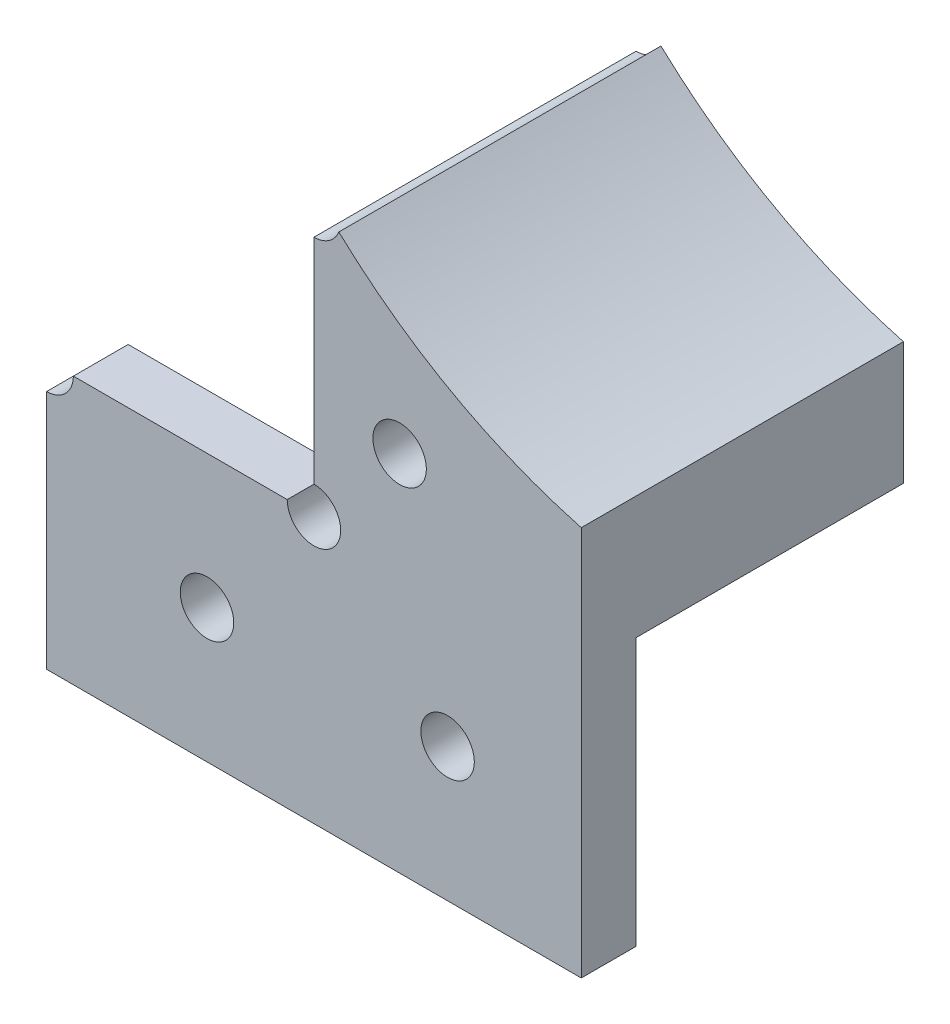
ISO-10303-21;
HEADER;
FILE_DESCRIPTION(('STEP AP214'),'2;1');
FILE_NAME('part.step','',(''),(''),'','','');
FILE_SCHEMA(('AUTOMOTIVE_DESIGN { 1 0 10303 214 1 1 1 1 }'));
ENDSEC;
DATA;
#1=APPLICATION_CONTEXT('core data for automotive mechanical design processes');
#2=APPLICATION_PROTOCOL_DEFINITION('international standard','automotive_design',2000,#1);
#3=PRODUCT_CONTEXT('',#1,'mechanical');
#4=PRODUCT('Part','Part','',(#3));
#5=PRODUCT_RELATED_PRODUCT_CATEGORY('part','',(#4));
#6=PRODUCT_DEFINITION_FORMATION('','',#4);
#7=PRODUCT_DEFINITION_CONTEXT('part definition',#1,'design');
#8=PRODUCT_DEFINITION('design','',#6,#7);
#9=PRODUCT_DEFINITION_SHAPE('','',#8);
#10=(LENGTH_UNIT() NAMED_UNIT(*) SI_UNIT(.MILLI.,.METRE.));
#11=(NAMED_UNIT(*) PLANE_ANGLE_UNIT() SI_UNIT($,.RADIAN.));
#12=(NAMED_UNIT(*) SI_UNIT($,.STERADIAN.) SOLID_ANGLE_UNIT());
#13=UNCERTAINTY_MEASURE_WITH_UNIT(LENGTH_MEASURE(1.E-05),#10,'distance_accuracy_value','');
#14=(GEOMETRIC_REPRESENTATION_CONTEXT(3) GLOBAL_UNCERTAINTY_ASSIGNED_CONTEXT((#13)) GLOBAL_UNIT_ASSIGNED_CONTEXT((#10,
#11,#12)) REPRESENTATION_CONTEXT('',''));
#15=CARTESIAN_POINT('',(0.,0.,0.));
#16=DIRECTION('',(0.,0.,1.));
#17=DIRECTION('',(1.,0.,0.));
#18=AXIS2_PLACEMENT_3D('',#15,#16,#17);
#19=CARTESIAN_POINT('',(10.,10.,4.1));
#20=DIRECTION('',(0.,-1.,0.));
#21=DIRECTION('',(1.,0.,0.));
#22=AXIS2_PLACEMENT_3D('',#19,#20,#21);
#23=PLANE('',#22);
#24=DIRECTION('',(-1.,0.,0.));
#25=VECTOR('',#24,1.);
#26=CARTESIAN_POINT('',(10.,10.,0.));
#27=LINE('',#26,#25);
#28=CARTESIAN_POINT('',(-12.,10.,0.));
#29=VERTEX_POINT('',#28);
#30=CARTESIAN_POINT('',(-28.,10.,0.));
#31=VERTEX_POINT('',#30);
#32=EDGE_CURVE('E182',#29,#31,#27,.T.);
#33=ORIENTED_EDGE('',*,*,#32,.T.);
#34=DIRECTION('',(0.,0.,1.));
#35=VECTOR('',#34,1.);
#36=CARTESIAN_POINT('',(-28.,10.,-20.));
#37=LINE('',#36,#35);
#38=CARTESIAN_POINT('',(-28.,10.,4.1));
#39=VERTEX_POINT('',#38);
#40=EDGE_CURVE('E154',#31,#39,#37,.T.);
#41=ORIENTED_EDGE('',*,*,#40,.T.);
#42=DIRECTION('',(-1.,0.,0.));
#43=VECTOR('',#42,1.);
#44=CARTESIAN_POINT('',(10.,10.,4.1));
#45=LINE('',#44,#43);
#46=CARTESIAN_POINT('',(-12.,10.,4.1));
#47=VERTEX_POINT('',#46);
#48=EDGE_CURVE('E172',#47,#39,#45,.T.);
#49=ORIENTED_EDGE('',*,*,#48,.F.);
#50=DIRECTION('',(0.,0.,1.));
#51=VECTOR('',#50,1.);
#52=CARTESIAN_POINT('',(-12.,10.,-20.));
#53=LINE('',#52,#51);
#54=EDGE_CURVE('E126',#29,#47,#53,.T.);
#55=ORIENTED_EDGE('',*,*,#54,.F.);
#56=EDGE_LOOP('',(#33,#41,#49,#55));
#57=FACE_BOUND('',#56,.T.);
#58=ADVANCED_FACE('F38',(#57),#23,.F.);
#59=CARTESIAN_POINT('',(0.,0.,4.1));
#60=DIRECTION('',(0.,0.,1.));
#61=DIRECTION('',(1.,0.,0.));
#62=AXIS2_PLACEMENT_3D('',#59,#60,#61);
#63=PLANE('',#62);
#64=CARTESIAN_POINT('',(-30.,10.,4.1));
#65=DIRECTION('',(0.,0.,1.));
#66=DIRECTION('',(1.,0.,0.));
#67=AXIS2_PLACEMENT_3D('',#64,#65,#66);
#68=CIRCLE('',#67,2.);
#69=CARTESIAN_POINT('',(-30.,8.,4.1));
#70=VERTEX_POINT('',#69);
#71=EDGE_CURVE('E221',#70,#39,#68,.T.);
#72=ORIENTED_EDGE('',*,*,#71,.F.);
#73=DIRECTION('',(0.,-1.,0.));
#74=VECTOR('',#73,1.);
#75=CARTESIAN_POINT('',(-30.,-10.,4.1));
#76=LINE('',#75,#74);
#77=CARTESIAN_POINT('',(-30.,-10.,4.1));
#78=VERTEX_POINT('',#77);
#79=EDGE_CURVE('E175',#70,#78,#76,.T.);
#80=ORIENTED_EDGE('',*,*,#79,.T.);
#81=DIRECTION('',(1.,0.,0.));
#82=VECTOR('',#81,1.);
#83=CARTESIAN_POINT('',(10.,-10.,4.1));
#84=LINE('',#83,#82);
#85=CARTESIAN_POINT('',(10.,-10.,4.1));
#86=VERTEX_POINT('',#85);
#87=EDGE_CURVE('E177',#78,#86,#84,.T.);
#88=ORIENTED_EDGE('',*,*,#87,.T.);
#89=DIRECTION('',(0.,1.,0.));
#90=VECTOR('',#89,1.);
#91=CARTESIAN_POINT('',(10.,-10.,4.1));
#92=LINE('',#91,#90);
#93=CARTESIAN_POINT('',(10.,19.1783710073717,4.1));
#94=VERTEX_POINT('',#93);
#95=EDGE_CURVE('E169',#86,#94,#92,.T.);
#96=ORIENTED_EDGE('',*,*,#95,.T.);
#97=CARTESIAN_POINT('',(21.2157347929413,60.6899030563627,4.1));
#98=DIRECTION('',(0.,0.,1.));
#99=DIRECTION('',(1.,0.,0.));
#100=AXIS2_PLACEMENT_3D('',#97,#98,#99);
#101=CIRCLE('',#100,43.);
#102=CARTESIAN_POINT('',(-8.1386652305326,29.2682672099928,4.1));
#103=VERTEX_POINT('',#102);
#104=EDGE_CURVE('E235',#103,#94,#101,.T.);
#105=ORIENTED_EDGE('',*,*,#104,.F.);
#106=CARTESIAN_POINT('',(-10.,30.,4.1));
#107=DIRECTION('',(0.,0.,1.));
#108=DIRECTION('',(1.,0.,0.));
#109=AXIS2_PLACEMENT_3D('',#106,#107,#108);
#110=CIRCLE('',#109,2.);
#111=CARTESIAN_POINT('',(-10.,28.,4.1));
#112=VERTEX_POINT('',#111);
#113=EDGE_CURVE('E148',#112,#103,#110,.T.);
#114=ORIENTED_EDGE('',*,*,#113,.F.);
#115=DIRECTION('',(0.,-1.,0.));
#116=VECTOR('',#115,1.);
#117=CARTESIAN_POINT('',(-10.,10.,4.1));
#118=LINE('',#117,#116);
#119=CARTESIAN_POINT('',(-10.,12.,4.1));
#120=VERTEX_POINT('',#119);
#121=EDGE_CURVE('E138',#112,#120,#118,.T.);
#122=ORIENTED_EDGE('',*,*,#121,.T.);
#123=CARTESIAN_POINT('',(-10.,10.,4.1));
#124=DIRECTION('',(0.,0.,1.));
#125=DIRECTION('',(1.,0.,0.));
#126=AXIS2_PLACEMENT_3D('',#123,#124,#125);
#127=CIRCLE('',#126,2.);
#128=EDGE_CURVE('E120',#47,#120,#127,.T.);
#129=ORIENTED_EDGE('',*,*,#128,.F.);
#130=ORIENTED_EDGE('',*,*,#48,.T.);
#131=EDGE_LOOP('',(#72,#80,#88,#96,#105,#114,#122,#129,#130));
#132=FACE_BOUND('',#131,.T.);
#133=CARTESIAN_POINT('',(-18.,0.,4.1));
#134=DIRECTION('',(0.,0.,1.));
#135=DIRECTION('',(1.,0.,0.));
#136=AXIS2_PLACEMENT_3D('',#133,#134,#135);
#137=CIRCLE('',#136,2.);
#138=CARTESIAN_POINT('',(-16.,0.,4.1));
#139=VERTEX_POINT('',#138);
#140=EDGE_CURVE('E224',#139,#139,#137,.T.);
#141=ORIENTED_EDGE('',*,*,#140,.F.);
#142=EDGE_LOOP('',(#141));
#143=FACE_BOUND('',#142,.T.);
#144=CARTESIAN_POINT('',(-3.58918550368584,17.1783710073717,4.1));
#145=DIRECTION('',(0.,0.,1.));
#146=DIRECTION('',(1.,0.,0.));
#147=AXIS2_PLACEMENT_3D('',#144,#145,#146);
#148=CIRCLE('',#147,2.);
#149=CARTESIAN_POINT('',(-1.58918550368584,17.1783710073717,4.1));
#150=VERTEX_POINT('',#149);
#151=EDGE_CURVE('E284',#150,#150,#148,.T.);
#152=ORIENTED_EDGE('',*,*,#151,.F.);
#153=EDGE_LOOP('',(#152));
#154=FACE_BOUND('',#153,.T.);
#155=CARTESIAN_POINT('',(0.,0.,4.1));
#156=DIRECTION('',(0.,0.,1.));
#157=DIRECTION('',(1.,0.,0.));
#158=AXIS2_PLACEMENT_3D('',#155,#156,#157);
#159=CIRCLE('',#158,2.);
#160=CARTESIAN_POINT('',(2.,0.,4.1));
#161=VERTEX_POINT('',#160);
#162=EDGE_CURVE('E163',#161,#161,#159,.T.);
#163=ORIENTED_EDGE('',*,*,#162,.F.);
#164=EDGE_LOOP('',(#163));
#165=FACE_BOUND('',#164,.T.);
#166=ADVANCED_FACE('F144',(#132,#143,#154,#165),#63,.T.);
#167=CARTESIAN_POINT('',(0.,0.,0.));
#168=DIRECTION('',(0.,0.,1.));
#169=DIRECTION('',(1.,0.,0.));
#170=AXIS2_PLACEMENT_3D('',#167,#168,#169);
#171=PLANE('',#170);
#172=CARTESIAN_POINT('',(-18.,0.,0.));
#173=DIRECTION('',(0.,0.,1.));
#174=DIRECTION('',(1.,0.,0.));
#175=AXIS2_PLACEMENT_3D('',#172,#173,#174);
#176=CIRCLE('',#175,2.);
#177=CARTESIAN_POINT('',(-16.,0.,0.));
#178=VERTEX_POINT('',#177);
#179=EDGE_CURVE('E42',#178,#178,#176,.T.);
#180=ORIENTED_EDGE('',*,*,#179,.T.);
#181=EDGE_LOOP('',(#180));
#182=FACE_BOUND('',#181,.T.);
#183=DIRECTION('',(0.,-1.,0.));
#184=VECTOR('',#183,1.);
#185=CARTESIAN_POINT('',(-30.,-10.,0.));
#186=LINE('',#185,#184);
#187=CARTESIAN_POINT('',(-30.,8.,0.));
#188=VERTEX_POINT('',#187);
#189=CARTESIAN_POINT('',(-30.,-10.,0.));
#190=VERTEX_POINT('',#189);
#191=EDGE_CURVE('E186',#188,#190,#186,.T.);
#192=ORIENTED_EDGE('',*,*,#191,.F.);
#193=CARTESIAN_POINT('',(-30.,10.,0.));
#194=DIRECTION('',(0.,0.,1.));
#195=DIRECTION('',(1.,0.,0.));
#196=AXIS2_PLACEMENT_3D('',#193,#194,#195);
#197=CIRCLE('',#196,2.);
#198=EDGE_CURVE('E54',#188,#31,#197,.T.);
#199=ORIENTED_EDGE('',*,*,#198,.T.);
#200=ORIENTED_EDGE('',*,*,#32,.F.);
#201=CARTESIAN_POINT('',(-10.,10.,0.));
#202=DIRECTION('',(0.,0.,1.));
#203=DIRECTION('',(1.,0.,0.));
#204=AXIS2_PLACEMENT_3D('',#201,#202,#203);
#205=CIRCLE('',#204,2.);
#206=CARTESIAN_POINT('',(-8.,10.,0.));
#207=VERTEX_POINT('',#206);
#208=EDGE_CURVE('E205',#29,#207,#205,.T.);
#209=ORIENTED_EDGE('',*,*,#208,.T.);
#210=CARTESIAN_POINT('',(10.,10.,0.));
#211=VERTEX_POINT('',#210);
#212=EDGE_CURVE('E183',#211,#207,#27,.T.);
#213=ORIENTED_EDGE('',*,*,#212,.F.);
#214=DIRECTION('',(0.,1.,0.));
#215=VECTOR('',#214,1.);
#216=CARTESIAN_POINT('',(10.,-10.,0.));
#217=LINE('',#216,#215);
#218=CARTESIAN_POINT('',(10.,-10.,0.));
#219=VERTEX_POINT('',#218);
#220=EDGE_CURVE('E166',#219,#211,#217,.T.);
#221=ORIENTED_EDGE('',*,*,#220,.F.);
#222=DIRECTION('',(1.,0.,0.));
#223=VECTOR('',#222,1.);
#224=CARTESIAN_POINT('',(10.,-10.,0.));
#225=LINE('',#224,#223);
#226=EDGE_CURVE('E173',#190,#219,#225,.T.);
#227=ORIENTED_EDGE('',*,*,#226,.F.);
#228=EDGE_LOOP('',(#192,#199,#200,#209,#213,#221,#227));
#229=FACE_BOUND('',#228,.T.);
#230=CARTESIAN_POINT('',(0.,0.,0.));
#231=DIRECTION('',(0.,0.,1.));
#232=DIRECTION('',(1.,0.,0.));
#233=AXIS2_PLACEMENT_3D('',#230,#231,#232);
#234=CIRCLE('',#233,2.);
#235=CARTESIAN_POINT('',(2.,0.,0.));
#236=VERTEX_POINT('',#235);
#237=EDGE_CURVE('E162',#236,#236,#234,.T.);
#238=ORIENTED_EDGE('',*,*,#237,.T.);
#239=EDGE_LOOP('',(#238));
#240=FACE_BOUND('',#239,.T.);
#241=ADVANCED_FACE('F260',(#182,#229,#240),#171,.F.);
#242=CARTESIAN_POINT('',(10.,-10.,4.1));
#243=DIRECTION('',(-1.,0.,0.));
#244=DIRECTION('',(0.,0.,1.));
#245=AXIS2_PLACEMENT_3D('',#242,#243,#244);
#246=PLANE('',#245);
#247=DIRECTION('',(0.,1.,0.));
#248=VECTOR('',#247,1.);
#249=CARTESIAN_POINT('',(10.,10.,-20.));
#250=LINE('',#249,#248);
#251=CARTESIAN_POINT('',(10.,10.,-20.));
#252=VERTEX_POINT('',#251);
#253=CARTESIAN_POINT('',(10.,19.1783710073717,-20.));
#254=VERTEX_POINT('',#253);
#255=EDGE_CURVE('E149',#252,#254,#250,.T.);
#256=ORIENTED_EDGE('',*,*,#255,.T.);
#257=DIRECTION('',(0.,0.,1.));
#258=VECTOR('',#257,1.);
#259=CARTESIAN_POINT('',(10.,19.1783710073717,-20.));
#260=LINE('',#259,#258);
#261=EDGE_CURVE('E206',#254,#94,#260,.T.);
#262=ORIENTED_EDGE('',*,*,#261,.T.);
#263=ORIENTED_EDGE('',*,*,#95,.F.);
#264=DIRECTION('',(0.,0.,-1.));
#265=VECTOR('',#264,1.);
#266=CARTESIAN_POINT('',(10.,-10.,4.1));
#267=LINE('',#266,#265);
#268=EDGE_CURVE('E179',#86,#219,#267,.T.);
#269=ORIENTED_EDGE('',*,*,#268,.T.);
#270=ORIENTED_EDGE('',*,*,#220,.T.);
#271=DIRECTION('',(0.,0.,1.));
#272=VECTOR('',#271,1.);
#273=CARTESIAN_POINT('',(10.,10.,-20.));
#274=LINE('',#273,#272);
#275=EDGE_CURVE('E159',#252,#211,#274,.T.);
#276=ORIENTED_EDGE('',*,*,#275,.F.);
#277=EDGE_LOOP('',(#256,#262,#263,#269,#270,#276));
#278=FACE_BOUND('',#277,.T.);
#279=ADVANCED_FACE('F40',(#278),#246,.F.);
#280=CARTESIAN_POINT('',(-30.,-10.,4.1));
#281=DIRECTION('',(1.,0.,0.));
#282=DIRECTION('',(0.,0.,-1.));
#283=AXIS2_PLACEMENT_3D('',#280,#281,#282);
#284=PLANE('',#283);
#285=ORIENTED_EDGE('',*,*,#79,.F.);
#286=DIRECTION('',(0.,0.,1.));
#287=VECTOR('',#286,1.);
#288=CARTESIAN_POINT('',(-30.,8.,-20.));
#289=LINE('',#288,#287);
#290=EDGE_CURVE('E11',#70,#188,#289,.F.);
#291=ORIENTED_EDGE('',*,*,#290,.T.);
#292=ORIENTED_EDGE('',*,*,#191,.T.);
#293=DIRECTION('',(0.,0.,-1.));
#294=VECTOR('',#293,1.);
#295=CARTESIAN_POINT('',(-30.,-10.,4.1));
#296=LINE('',#295,#294);
#297=EDGE_CURVE('E191',#78,#190,#296,.T.);
#298=ORIENTED_EDGE('',*,*,#297,.F.);
#299=EDGE_LOOP('',(#285,#291,#292,#298));
#300=FACE_BOUND('',#299,.T.);
#301=ADVANCED_FACE('F227',(#300),#284,.F.);
#302=CARTESIAN_POINT('',(10.,-10.,4.1));
#303=DIRECTION('',(0.,1.,0.));
#304=DIRECTION('',(-1.,0.,0.));
#305=AXIS2_PLACEMENT_3D('',#302,#303,#304);
#306=PLANE('',#305);
#307=ORIENTED_EDGE('',*,*,#226,.T.);
#308=ORIENTED_EDGE('',*,*,#268,.F.);
#309=ORIENTED_EDGE('',*,*,#87,.F.);
#310=ORIENTED_EDGE('',*,*,#297,.T.);
#311=EDGE_LOOP('',(#307,#308,#309,#310));
#312=FACE_BOUND('',#311,.T.);
#313=ADVANCED_FACE('F233',(#312),#306,.F.);
#314=CARTESIAN_POINT('',(0.,0.,4.1));
#315=DIRECTION('',(0.,0.,-1.));
#316=DIRECTION('',(-1.,0.,0.));
#317=AXIS2_PLACEMENT_3D('',#314,#315,#316);
#318=CYLINDRICAL_SURFACE('',#317,2.);
#319=ORIENTED_EDGE('',*,*,#162,.T.);
#320=EDGE_LOOP('',(#319));
#321=FACE_BOUND('',#320,.T.);
#322=ORIENTED_EDGE('',*,*,#237,.F.);
#323=EDGE_LOOP('',(#322));
#324=FACE_BOUND('',#323,.T.);
#325=ADVANCED_FACE('F267',(#321,#324),#318,.F.);
#326=CARTESIAN_POINT('',(10.,10.,-20.));
#327=DIRECTION('',(0.,-1.,0.));
#328=DIRECTION('',(1.,0.,0.));
#329=AXIS2_PLACEMENT_3D('',#326,#327,#328);
#330=PLANE('',#329);
#331=DIRECTION('',(0.,0.,1.));
#332=VECTOR('',#331,1.);
#333=CARTESIAN_POINT('',(-8.,10.,-20.));
#334=LINE('',#333,#332);
#335=CARTESIAN_POINT('',(-8.,10.,-20.));
#336=VERTEX_POINT('',#335);
#337=EDGE_CURVE('E200',#336,#207,#334,.T.);
#338=ORIENTED_EDGE('',*,*,#337,.F.);
#339=DIRECTION('',(1.,0.,0.));
#340=VECTOR('',#339,1.);
#341=CARTESIAN_POINT('',(10.,10.,-20.));
#342=LINE('',#341,#340);
#343=EDGE_CURVE('E157',#336,#252,#342,.T.);
#344=ORIENTED_EDGE('',*,*,#343,.T.);
#345=ORIENTED_EDGE('',*,*,#275,.T.);
#346=ORIENTED_EDGE('',*,*,#212,.T.);
#347=EDGE_LOOP('',(#338,#344,#345,#346));
#348=FACE_BOUND('',#347,.T.);
#349=ADVANCED_FACE('F203',(#348),#330,.T.);
#350=CARTESIAN_POINT('',(-10.,10.,-20.));
#351=DIRECTION('',(-1.,0.,0.));
#352=DIRECTION('',(0.,0.,1.));
#353=AXIS2_PLACEMENT_3D('',#350,#351,#352);
#354=PLANE('',#353);
#355=DIRECTION('',(0.,0.,1.));
#356=VECTOR('',#355,1.);
#357=CARTESIAN_POINT('',(-10.,12.,-20.));
#358=LINE('',#357,#356);
#359=CARTESIAN_POINT('',(-10.,12.,-20.));
#360=VERTEX_POINT('',#359);
#361=EDGE_CURVE('E123',#360,#120,#358,.T.);
#362=ORIENTED_EDGE('',*,*,#361,.T.);
#363=ORIENTED_EDGE('',*,*,#121,.F.);
#364=DIRECTION('',(0.,0.,1.));
#365=VECTOR('',#364,1.);
#366=CARTESIAN_POINT('',(-10.,28.,-20.));
#367=LINE('',#366,#365);
#368=CARTESIAN_POINT('',(-10.,28.,-20.));
#369=VERTEX_POINT('',#368);
#370=EDGE_CURVE('E213',#369,#112,#367,.T.);
#371=ORIENTED_EDGE('',*,*,#370,.F.);
#372=DIRECTION('',(0.,-1.,0.));
#373=VECTOR('',#372,1.);
#374=CARTESIAN_POINT('',(-10.,10.,-20.));
#375=LINE('',#374,#373);
#376=EDGE_CURVE('E140',#369,#360,#375,.T.);
#377=ORIENTED_EDGE('',*,*,#376,.T.);
#378=EDGE_LOOP('',(#362,#363,#371,#377));
#379=FACE_BOUND('',#378,.T.);
#380=ADVANCED_FACE('F136',(#379),#354,.T.);
#381=CARTESIAN_POINT('',(0.,0.,-20.));
#382=DIRECTION('',(0.,0.,1.));
#383=DIRECTION('',(1.,0.,0.));
#384=AXIS2_PLACEMENT_3D('',#381,#382,#383);
#385=PLANE('',#384);
#386=CARTESIAN_POINT('',(-3.58918550368584,17.1783710073717,-20.));
#387=DIRECTION('',(0.,0.,1.));
#388=DIRECTION('',(1.,0.,0.));
#389=AXIS2_PLACEMENT_3D('',#386,#387,#388);
#390=CIRCLE('',#389,2.);
#391=CARTESIAN_POINT('',(-1.58918550368584,17.1783710073717,-20.));
#392=VERTEX_POINT('',#391);
#393=EDGE_CURVE('E131',#392,#392,#390,.T.);
#394=ORIENTED_EDGE('',*,*,#393,.T.);
#395=EDGE_LOOP('',(#394));
#396=FACE_BOUND('',#395,.T.);
#397=ORIENTED_EDGE('',*,*,#343,.F.);
#398=CARTESIAN_POINT('',(-10.,10.,-20.));
#399=DIRECTION('',(0.,0.,1.));
#400=DIRECTION('',(1.,0.,0.));
#401=AXIS2_PLACEMENT_3D('',#398,#399,#400);
#402=CIRCLE('',#401,2.);
#403=EDGE_CURVE('E47',#336,#360,#402,.T.);
#404=ORIENTED_EDGE('',*,*,#403,.T.);
#405=ORIENTED_EDGE('',*,*,#376,.F.);
#406=CARTESIAN_POINT('',(-10.,30.,-20.));
#407=DIRECTION('',(0.,0.,1.));
#408=DIRECTION('',(1.,0.,0.));
#409=AXIS2_PLACEMENT_3D('',#406,#407,#408);
#410=CIRCLE('',#409,2.);
#411=CARTESIAN_POINT('',(-8.1386652305326,29.2682672099928,-20.));
#412=VERTEX_POINT('',#411);
#413=EDGE_CURVE('E239',#369,#412,#410,.T.);
#414=ORIENTED_EDGE('',*,*,#413,.T.);
#415=CARTESIAN_POINT('',(21.2157347929413,60.6899030563627,-20.));
#416=DIRECTION('',(0.,0.,1.));
#417=DIRECTION('',(1.,0.,0.));
#418=AXIS2_PLACEMENT_3D('',#415,#416,#417);
#419=CIRCLE('',#418,43.);
#420=EDGE_CURVE('E61',#412,#254,#419,.T.);
#421=ORIENTED_EDGE('',*,*,#420,.T.);
#422=ORIENTED_EDGE('',*,*,#255,.F.);
#423=EDGE_LOOP('',(#397,#404,#405,#414,#421,#422));
#424=FACE_BOUND('',#423,.T.);
#425=ADVANCED_FACE('F196',(#396,#424),#385,.F.);
#426=CARTESIAN_POINT('',(21.2157347929413,60.6899030563627,-20.));
#427=DIRECTION('',(0.,0.,1.));
#428=DIRECTION('',(1.,0.,0.));
#429=AXIS2_PLACEMENT_3D('',#426,#427,#428);
#430=CYLINDRICAL_SURFACE('',#429,43.);
#431=ORIENTED_EDGE('',*,*,#104,.T.);
#432=ORIENTED_EDGE('',*,*,#261,.F.);
#433=ORIENTED_EDGE('',*,*,#420,.F.);
#434=DIRECTION('',(0.,0.,1.));
#435=VECTOR('',#434,1.);
#436=CARTESIAN_POINT('',(-8.1386652305326,29.2682672099928,-20.));
#437=LINE('',#436,#435);
#438=EDGE_CURVE('E210',#412,#103,#437,.T.);
#439=ORIENTED_EDGE('',*,*,#438,.T.);
#440=EDGE_LOOP('',(#431,#432,#433,#439));
#441=FACE_BOUND('',#440,.T.);
#442=ADVANCED_FACE('F238',(#441),#430,.F.);
#443=CARTESIAN_POINT('',(-10.,30.,-20.));
#444=DIRECTION('',(0.,0.,1.));
#445=DIRECTION('',(1.,0.,0.));
#446=AXIS2_PLACEMENT_3D('',#443,#444,#445);
#447=CYLINDRICAL_SURFACE('',#446,2.);
#448=ORIENTED_EDGE('',*,*,#113,.T.);
#449=ORIENTED_EDGE('',*,*,#438,.F.);
#450=ORIENTED_EDGE('',*,*,#413,.F.);
#451=ORIENTED_EDGE('',*,*,#370,.T.);
#452=EDGE_LOOP('',(#448,#449,#450,#451));
#453=FACE_BOUND('',#452,.T.);
#454=ADVANCED_FACE('F245',(#453),#447,.F.);
#455=CARTESIAN_POINT('',(-10.,10.,-20.));
#456=DIRECTION('',(0.,0.,1.));
#457=DIRECTION('',(1.,0.,0.));
#458=AXIS2_PLACEMENT_3D('',#455,#456,#457);
#459=CYLINDRICAL_SURFACE('',#458,2.);
#460=ORIENTED_EDGE('',*,*,#54,.T.);
#461=ORIENTED_EDGE('',*,*,#128,.T.);
#462=ORIENTED_EDGE('',*,*,#361,.F.);
#463=ORIENTED_EDGE('',*,*,#403,.F.);
#464=ORIENTED_EDGE('',*,*,#337,.T.);
#465=ORIENTED_EDGE('',*,*,#208,.F.);
#466=EDGE_LOOP('',(#460,#461,#462,#463,#464,#465));
#467=FACE_BOUND('',#466,.T.);
#468=ADVANCED_FACE('F122',(#467),#459,.F.);
#469=CARTESIAN_POINT('',(-3.58918550368584,17.1783710073717,-20.));
#470=DIRECTION('',(0.,0.,1.));
#471=DIRECTION('',(1.,0.,0.));
#472=AXIS2_PLACEMENT_3D('',#469,#470,#471);
#473=CYLINDRICAL_SURFACE('',#472,2.);
#474=ORIENTED_EDGE('',*,*,#393,.F.);
#475=EDGE_LOOP('',(#474));
#476=FACE_BOUND('',#475,.T.);
#477=ORIENTED_EDGE('',*,*,#151,.T.);
#478=EDGE_LOOP('',(#477));
#479=FACE_BOUND('',#478,.T.);
#480=ADVANCED_FACE('F252',(#476,#479),#473,.F.);
#481=CARTESIAN_POINT('',(-30.,10.,-20.));
#482=DIRECTION('',(0.,0.,1.));
#483=DIRECTION('',(1.,0.,0.));
#484=AXIS2_PLACEMENT_3D('',#481,#482,#483);
#485=CYLINDRICAL_SURFACE('',#484,2.);
#486=ORIENTED_EDGE('',*,*,#198,.F.);
#487=ORIENTED_EDGE('',*,*,#290,.F.);
#488=ORIENTED_EDGE('',*,*,#71,.T.);
#489=ORIENTED_EDGE('',*,*,#40,.F.);
#490=EDGE_LOOP('',(#486,#487,#488,#489));
#491=FACE_BOUND('',#490,.T.);
#492=ADVANCED_FACE('F304',(#491),#485,.F.);
#493=CARTESIAN_POINT('',(-18.,0.,-20.));
#494=DIRECTION('',(0.,0.,1.));
#495=DIRECTION('',(1.,0.,0.));
#496=AXIS2_PLACEMENT_3D('',#493,#494,#495);
#497=CYLINDRICAL_SURFACE('',#496,2.);
#498=ORIENTED_EDGE('',*,*,#140,.T.);
#499=EDGE_LOOP('',(#498));
#500=FACE_BOUND('',#499,.T.);
#501=ORIENTED_EDGE('',*,*,#179,.F.);
#502=EDGE_LOOP('',(#501));
#503=FACE_BOUND('',#502,.T.);
#504=ADVANCED_FACE('F293',(#500,#503),#497,.F.);
#505=CLOSED_SHELL('',(#58,#166,#241,#279,#301,#313,#325,#349,#380,#425,#442,#454,#468,#480,#492,#504));
#506=MANIFOLD_SOLID_BREP('B2',#505);
#507=ADVANCED_BREP_SHAPE_REPRESENTATION('',(#18,#506),#14);
#508=SHAPE_DEFINITION_REPRESENTATION(#9,#507);
ENDSEC;
END-ISO-10303-21;
